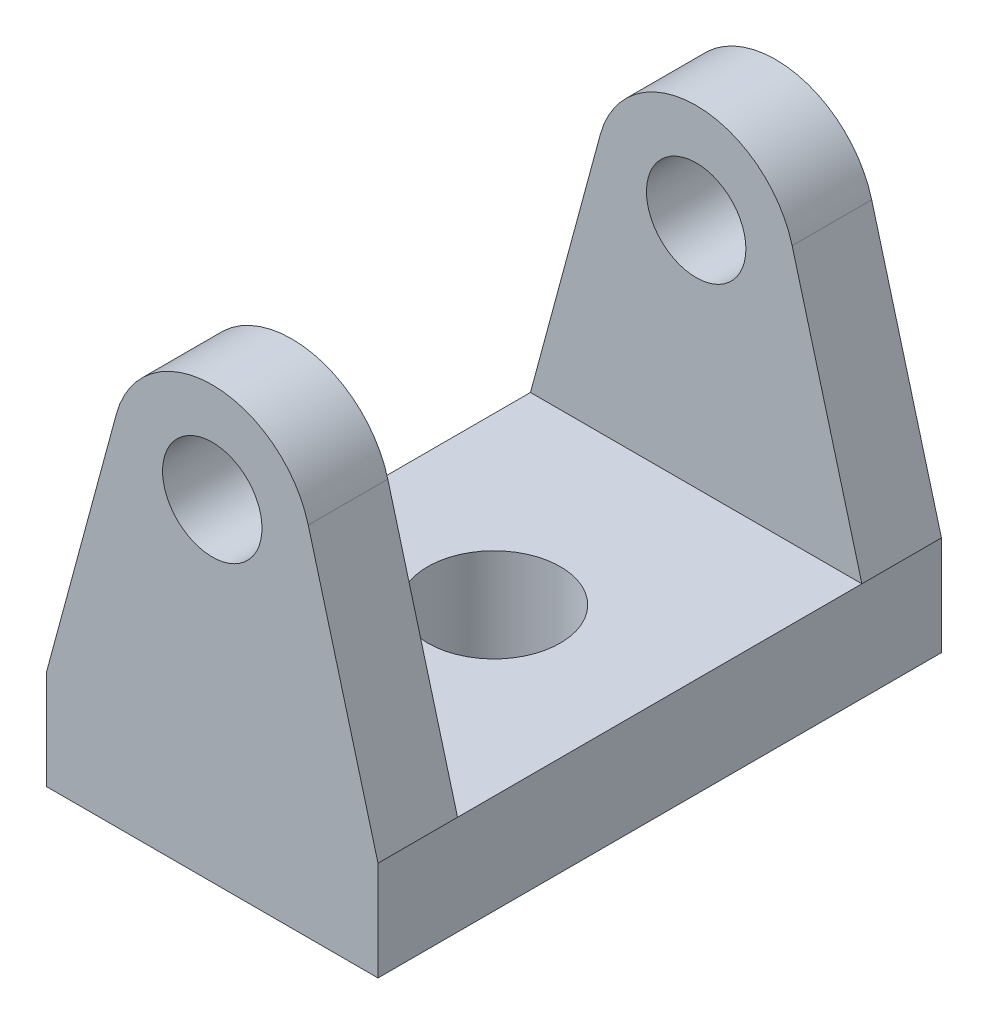
ISO-10303-21;
HEADER;
FILE_DESCRIPTION(('STEP AP214'),'2;1');
FILE_NAME('part.step','',(''),(''),'','','');
FILE_SCHEMA(('AUTOMOTIVE_DESIGN { 1 0 10303 214 1 1 1 1 }'));
ENDSEC;
DATA;
#1=APPLICATION_CONTEXT('core data for automotive mechanical design processes');
#2=APPLICATION_PROTOCOL_DEFINITION('international standard','automotive_design',2000,#1);
#3=PRODUCT_CONTEXT('',#1,'mechanical');
#4=PRODUCT('Part','Part','',(#3));
#5=PRODUCT_RELATED_PRODUCT_CATEGORY('part','',(#4));
#6=PRODUCT_DEFINITION_FORMATION('','',#4);
#7=PRODUCT_DEFINITION_CONTEXT('part definition',#1,'design');
#8=PRODUCT_DEFINITION('design','',#6,#7);
#9=PRODUCT_DEFINITION_SHAPE('','',#8);
#10=(LENGTH_UNIT() NAMED_UNIT(*) SI_UNIT(.MILLI.,.METRE.));
#11=(NAMED_UNIT(*) PLANE_ANGLE_UNIT() SI_UNIT($,.RADIAN.));
#12=(NAMED_UNIT(*) SI_UNIT($,.STERADIAN.) SOLID_ANGLE_UNIT());
#13=UNCERTAINTY_MEASURE_WITH_UNIT(LENGTH_MEASURE(1.E-05),#10,'distance_accuracy_value','');
#14=(GEOMETRIC_REPRESENTATION_CONTEXT(3) GLOBAL_UNCERTAINTY_ASSIGNED_CONTEXT((#13)) GLOBAL_UNIT_ASSIGNED_CONTEXT((#10,
#11,#12)) REPRESENTATION_CONTEXT('',''));
#15=CARTESIAN_POINT('',(0.,0.,0.));
#16=DIRECTION('',(0.,0.,1.));
#17=DIRECTION('',(1.,0.,0.));
#18=AXIS2_PLACEMENT_3D('',#15,#16,#17);
#19=CARTESIAN_POINT('',(50.3737158489723,13.6175602993033,-85.));
#20=DIRECTION('',(0.965348705920133,0.260963361371524,0.));
#21=DIRECTION('',(-0.260963361371524,0.965348705920133,0.));
#22=AXIS2_PLACEMENT_3D('',#19,#20,#21);
#23=PLANE('',#22);
#24=DIRECTION('',(0.,0.,1.));
#25=VECTOR('',#24,1.);
#26=CARTESIAN_POINT('',(39.480230588802,53.9144504205729,-85.));
#27=LINE('',#26,#25);
#28=CARTESIAN_POINT('',(39.480230588802,53.9144504205729,-85.));
#29=VERTEX_POINT('',#28);
#30=CARTESIAN_POINT('',(39.480230588802,53.9144504205729,-73.));
#31=VERTEX_POINT('',#30);
#32=EDGE_CURVE('E94',#29,#31,#27,.T.);
#33=ORIENTED_EDGE('',*,*,#32,.T.);
#34=DIRECTION('',(0.260963361371524,-0.965348705920133,0.));
#35=VECTOR('',#34,1.);
#36=CARTESIAN_POINT('',(50.3737158489723,13.6175602993033,-73.));
#37=LINE('',#36,#35);
#38=CARTESIAN_POINT('',(50.,15.,-73.));
#39=VERTEX_POINT('',#38);
#40=EDGE_CURVE('E199',#31,#39,#37,.T.);
#41=ORIENTED_EDGE('',*,*,#40,.T.);
#42=DIRECTION('',(0.,0.,1.));
#43=VECTOR('',#42,1.);
#44=CARTESIAN_POINT('',(50.,15.,-85.));
#45=LINE('',#44,#43);
#46=CARTESIAN_POINT('',(50.,15.,-85.));
#47=VERTEX_POINT('',#46);
#48=EDGE_CURVE('E11',#47,#39,#45,.T.);
#49=ORIENTED_EDGE('',*,*,#48,.F.);
#50=DIRECTION('',(-0.260963361371524,0.965348705920133,0.));
#51=VECTOR('',#50,1.);
#52=CARTESIAN_POINT('',(50.3737158489723,13.6175602993033,-85.));
#53=LINE('',#52,#51);
#54=EDGE_CURVE('E162',#47,#29,#53,.T.);
#55=ORIENTED_EDGE('',*,*,#54,.T.);
#56=EDGE_LOOP('',(#33,#41,#49,#55));
#57=FACE_BOUND('',#56,.T.);
#58=ADVANCED_FACE('F35',(#57),#23,.T.);
#59=CARTESIAN_POINT('',(50.,15.,-12.));
#60=VERTEX_POINT('',#59);
#61=CARTESIAN_POINT('',(50.,15.,0.));
#62=VERTEX_POINT('',#61);
#63=EDGE_CURVE('E43',#60,#62,#45,.T.);
#64=ORIENTED_EDGE('',*,*,#63,.F.);
#65=DIRECTION('',(-0.260963361371524,0.965348705920133,0.));
#66=VECTOR('',#65,1.);
#67=CARTESIAN_POINT('',(50.3737158489723,13.6175602993033,-12.));
#68=LINE('',#67,#66);
#69=CARTESIAN_POINT('',(39.480230588802,53.9144504205729,-12.));
#70=VERTEX_POINT('',#69);
#71=EDGE_CURVE('E191',#60,#70,#68,.T.);
#72=ORIENTED_EDGE('',*,*,#71,.T.);
#73=CARTESIAN_POINT('',(39.480230588802,53.9144504205729,0.));
#74=VERTEX_POINT('',#73);
#75=EDGE_CURVE('E144',#70,#74,#27,.T.);
#76=ORIENTED_EDGE('',*,*,#75,.T.);
#77=DIRECTION('',(-0.260963361371524,0.965348705920133,0.));
#78=VECTOR('',#77,1.);
#79=CARTESIAN_POINT('',(50.3737158489723,13.6175602993033,0.));
#80=LINE('',#79,#78);
#81=EDGE_CURVE('E145',#62,#74,#80,.T.);
#82=ORIENTED_EDGE('',*,*,#81,.F.);
#83=EDGE_LOOP('',(#64,#72,#76,#82));
#84=FACE_BOUND('',#83,.T.);
#85=ADVANCED_FACE('F225',(#84),#23,.T.);
#86=CARTESIAN_POINT('',(-3.77880964788852,1.02152813967486,-85.));
#87=DIRECTION('',(0.965348705920133,-0.260963361371523,0.));
#88=DIRECTION('',(0.260963361371523,0.965348705920133,0.));
#89=AXIS2_PLACEMENT_3D('',#86,#87,#88);
#90=PLANE('',#89);
#91=DIRECTION('',(-0.260963361371523,-0.965348705920133,0.));
#92=VECTOR('',#91,1.);
#93=CARTESIAN_POINT('',(-3.77880964788852,1.02152813967487,-73.));
#94=LINE('',#93,#92);
#95=CARTESIAN_POINT('',(10.519769411198,53.9144504205729,-73.));
#96=VERTEX_POINT('',#95);
#97=CARTESIAN_POINT('',(0.,15.,-73.));
#98=VERTEX_POINT('',#97);
#99=EDGE_CURVE('E196',#96,#98,#94,.T.);
#100=ORIENTED_EDGE('',*,*,#99,.F.);
#101=DIRECTION('',(0.,0.,1.));
#102=VECTOR('',#101,1.);
#103=CARTESIAN_POINT('',(10.519769411198,53.9144504205729,-85.));
#104=LINE('',#103,#102);
#105=CARTESIAN_POINT('',(10.519769411198,53.9144504205729,-85.));
#106=VERTEX_POINT('',#105);
#107=EDGE_CURVE('E167',#106,#96,#104,.T.);
#108=ORIENTED_EDGE('',*,*,#107,.F.);
#109=DIRECTION('',(0.260963361371523,0.965348705920133,0.));
#110=VECTOR('',#109,1.);
#111=CARTESIAN_POINT('',(-3.77880964788852,1.02152813967486,-85.));
#112=LINE('',#111,#110);
#113=CARTESIAN_POINT('',(0.,15.,-85.));
#114=VERTEX_POINT('',#113);
#115=EDGE_CURVE('E134',#114,#106,#112,.T.);
#116=ORIENTED_EDGE('',*,*,#115,.F.);
#117=DIRECTION('',(0.,0.,1.));
#118=VECTOR('',#117,1.);
#119=CARTESIAN_POINT('',(0.,15.,-85.));
#120=LINE('',#119,#118);
#121=EDGE_CURVE('E128',#114,#98,#120,.T.);
#122=ORIENTED_EDGE('',*,*,#121,.T.);
#123=EDGE_LOOP('',(#100,#108,#116,#122));
#124=FACE_BOUND('',#123,.T.);
#125=ADVANCED_FACE('F222',(#124),#90,.F.);
#126=DIRECTION('',(0.260963361371523,0.965348705920133,0.));
#127=VECTOR('',#126,1.);
#128=CARTESIAN_POINT('',(-3.77880964788852,1.02152813967486,-12.));
#129=LINE('',#128,#127);
#130=CARTESIAN_POINT('',(0.,15.,-12.));
#131=VERTEX_POINT('',#130);
#132=CARTESIAN_POINT('',(10.519769411198,53.9144504205729,-12.));
#133=VERTEX_POINT('',#132);
#134=EDGE_CURVE('E51',#131,#133,#129,.T.);
#135=ORIENTED_EDGE('',*,*,#134,.F.);
#136=CARTESIAN_POINT('',(0.,15.,0.));
#137=VERTEX_POINT('',#136);
#138=EDGE_CURVE('E166',#131,#137,#120,.T.);
#139=ORIENTED_EDGE('',*,*,#138,.T.);
#140=DIRECTION('',(0.260963361371523,0.965348705920133,0.));
#141=VECTOR('',#140,1.);
#142=CARTESIAN_POINT('',(-3.77880964788852,1.02152813967486,0.));
#143=LINE('',#142,#141);
#144=CARTESIAN_POINT('',(10.519769411198,53.9144504205729,0.));
#145=VERTEX_POINT('',#144);
#146=EDGE_CURVE('E152',#137,#145,#143,.T.);
#147=ORIENTED_EDGE('',*,*,#146,.T.);
#148=EDGE_CURVE('E170',#133,#145,#104,.T.);
#149=ORIENTED_EDGE('',*,*,#148,.F.);
#150=EDGE_LOOP('',(#135,#139,#147,#149));
#151=FACE_BOUND('',#150,.T.);
#152=ADVANCED_FACE('F224',(#151),#90,.F.);
#153=CARTESIAN_POINT('',(25.,50.,-85.));
#154=DIRECTION('',(0.,0.,1.));
#155=DIRECTION('',(1.,0.,0.));
#156=AXIS2_PLACEMENT_3D('',#153,#154,#155);
#157=CYLINDRICAL_SURFACE('',#156,15.);
#158=ORIENTED_EDGE('',*,*,#107,.T.);
#159=CARTESIAN_POINT('',(25.,50.,-73.));
#160=DIRECTION('',(0.,0.,1.));
#161=DIRECTION('',(0.,-1.,0.));
#162=AXIS2_PLACEMENT_3D('',#159,#160,#161);
#163=CIRCLE('',#162,15.);
#164=EDGE_CURVE('E194',#96,#31,#163,.F.);
#165=ORIENTED_EDGE('',*,*,#164,.T.);
#166=ORIENTED_EDGE('',*,*,#32,.F.);
#167=CARTESIAN_POINT('',(25.,50.,-85.));
#168=DIRECTION('',(0.,0.,1.));
#169=DIRECTION('',(1.,0.,0.));
#170=AXIS2_PLACEMENT_3D('',#167,#168,#169);
#171=CIRCLE('',#170,15.);
#172=EDGE_CURVE('E136',#29,#106,#171,.T.);
#173=ORIENTED_EDGE('',*,*,#172,.T.);
#174=EDGE_LOOP('',(#158,#165,#166,#173));
#175=FACE_BOUND('',#174,.T.);
#176=ADVANCED_FACE('F202',(#175),#157,.T.);
#177=ORIENTED_EDGE('',*,*,#75,.F.);
#178=CARTESIAN_POINT('',(25.,50.,-12.));
#179=DIRECTION('',(0.,0.,-1.));
#180=DIRECTION('',(0.,1.,0.));
#181=AXIS2_PLACEMENT_3D('',#178,#179,#180);
#182=CIRCLE('',#181,15.);
#183=EDGE_CURVE('E173',#70,#133,#182,.F.);
#184=ORIENTED_EDGE('',*,*,#183,.T.);
#185=ORIENTED_EDGE('',*,*,#148,.T.);
#186=CARTESIAN_POINT('',(25.,50.,0.));
#187=DIRECTION('',(0.,0.,1.));
#188=DIRECTION('',(1.,0.,0.));
#189=AXIS2_PLACEMENT_3D('',#186,#187,#188);
#190=CIRCLE('',#189,15.);
#191=EDGE_CURVE('E148',#74,#145,#190,.T.);
#192=ORIENTED_EDGE('',*,*,#191,.F.);
#193=EDGE_LOOP('',(#177,#184,#185,#192));
#194=FACE_BOUND('',#193,.T.);
#195=ADVANCED_FACE('F261',(#194),#157,.T.);
#196=CARTESIAN_POINT('',(25.,50.,-85.));
#197=DIRECTION('',(0.,0.,1.));
#198=DIRECTION('',(1.,0.,0.));
#199=AXIS2_PLACEMENT_3D('',#196,#197,#198);
#200=CYLINDRICAL_SURFACE('',#199,7.50000000000001);
#201=CARTESIAN_POINT('',(25.,50.,-85.));
#202=DIRECTION('',(0.,0.,1.));
#203=DIRECTION('',(1.,0.,0.));
#204=AXIS2_PLACEMENT_3D('',#201,#202,#203);
#205=CIRCLE('',#204,7.50000000000001);
#206=CARTESIAN_POINT('',(32.5,50.,-85.));
#207=VERTEX_POINT('',#206);
#208=EDGE_CURVE('E141',#207,#207,#205,.T.);
#209=ORIENTED_EDGE('',*,*,#208,.F.);
#210=EDGE_LOOP('',(#209));
#211=FACE_BOUND('',#210,.T.);
#212=CARTESIAN_POINT('',(25.,50.,-73.));
#213=DIRECTION('',(0.,0.,1.));
#214=DIRECTION('',(0.,-1.,0.));
#215=AXIS2_PLACEMENT_3D('',#212,#213,#214);
#216=CIRCLE('',#215,7.50000000000001);
#217=CARTESIAN_POINT('',(25.,42.5,-73.));
#218=VERTEX_POINT('',#217);
#219=EDGE_CURVE('E38',#218,#218,#216,.F.);
#220=ORIENTED_EDGE('',*,*,#219,.F.);
#221=EDGE_LOOP('',(#220));
#222=FACE_BOUND('',#221,.T.);
#223=ADVANCED_FACE('F269',(#211,#222),#200,.F.);
#224=CARTESIAN_POINT('',(25.,50.,0.));
#225=DIRECTION('',(0.,0.,1.));
#226=DIRECTION('',(1.,0.,0.));
#227=AXIS2_PLACEMENT_3D('',#224,#225,#226);
#228=CIRCLE('',#227,7.50000000000001);
#229=CARTESIAN_POINT('',(32.5,50.,0.));
#230=VERTEX_POINT('',#229);
#231=EDGE_CURVE('E160',#230,#230,#228,.T.);
#232=ORIENTED_EDGE('',*,*,#231,.T.);
#233=EDGE_LOOP('',(#232));
#234=FACE_BOUND('',#233,.T.);
#235=CARTESIAN_POINT('',(25.,50.,-12.));
#236=DIRECTION('',(0.,0.,-1.));
#237=DIRECTION('',(0.,1.,0.));
#238=AXIS2_PLACEMENT_3D('',#235,#236,#237);
#239=CIRCLE('',#238,7.50000000000001);
#240=CARTESIAN_POINT('',(25.,57.5,-12.));
#241=VERTEX_POINT('',#240);
#242=EDGE_CURVE('E171',#241,#241,#239,.F.);
#243=ORIENTED_EDGE('',*,*,#242,.F.);
#244=EDGE_LOOP('',(#243));
#245=FACE_BOUND('',#244,.T.);
#246=ADVANCED_FACE('F278',(#234,#245),#200,.F.);
#247=CARTESIAN_POINT('',(50.,0.,-85.));
#248=DIRECTION('',(-1.,0.,0.));
#249=DIRECTION('',(0.,0.,1.));
#250=AXIS2_PLACEMENT_3D('',#247,#248,#249);
#251=PLANE('',#250);
#252=DIRECTION('',(0.,-1.,0.));
#253=VECTOR('',#252,1.);
#254=CARTESIAN_POINT('',(50.,0.,0.));
#255=LINE('',#254,#253);
#256=CARTESIAN_POINT('',(50.,0.,0.));
#257=VERTEX_POINT('',#256);
#258=EDGE_CURVE('E158',#62,#257,#255,.T.);
#259=ORIENTED_EDGE('',*,*,#258,.T.);
#260=DIRECTION('',(0.,0.,1.));
#261=VECTOR('',#260,1.);
#262=CARTESIAN_POINT('',(50.,0.,-85.));
#263=LINE('',#262,#261);
#264=CARTESIAN_POINT('',(50.,0.,-85.));
#265=VERTEX_POINT('',#264);
#266=EDGE_CURVE('E127',#265,#257,#263,.T.);
#267=ORIENTED_EDGE('',*,*,#266,.F.);
#268=DIRECTION('',(0.,-1.,0.));
#269=VECTOR('',#268,1.);
#270=CARTESIAN_POINT('',(50.,0.,-85.));
#271=LINE('',#270,#269);
#272=EDGE_CURVE('E114',#47,#265,#271,.T.);
#273=ORIENTED_EDGE('',*,*,#272,.F.);
#274=ORIENTED_EDGE('',*,*,#48,.T.);
#275=DIRECTION('',(0.,0.,-1.));
#276=VECTOR('',#275,1.);
#277=CARTESIAN_POINT('',(50.,15.,-85.));
#278=LINE('',#277,#276);
#279=EDGE_CURVE('E149',#60,#39,#278,.T.);
#280=ORIENTED_EDGE('',*,*,#279,.F.);
#281=ORIENTED_EDGE('',*,*,#63,.T.);
#282=EDGE_LOOP('',(#259,#267,#273,#274,#280,#281));
#283=FACE_BOUND('',#282,.T.);
#284=ADVANCED_FACE('F288',(#283),#251,.F.);
#285=CARTESIAN_POINT('',(0.,0.,-85.));
#286=DIRECTION('',(0.,1.,0.));
#287=DIRECTION('',(-1.,0.,0.));
#288=AXIS2_PLACEMENT_3D('',#285,#286,#287);
#289=PLANE('',#288);
#290=CARTESIAN_POINT('',(25.,0.,-42.5));
#291=DIRECTION('',(0.,1.,0.));
#292=DIRECTION('',(-1.,0.,0.));
#293=AXIS2_PLACEMENT_3D('',#290,#291,#292);
#294=CIRCLE('',#293,10.);
#295=CARTESIAN_POINT('',(15.,0.,-42.5));
#296=VERTEX_POINT('',#295);
#297=EDGE_CURVE('E374',#296,#296,#294,.T.);
#298=ORIENTED_EDGE('',*,*,#297,.T.);
#299=EDGE_LOOP('',(#298));
#300=FACE_BOUND('',#299,.T.);
#301=DIRECTION('',(-1.,0.,0.));
#302=VECTOR('',#301,1.);
#303=CARTESIAN_POINT('',(0.,0.,0.));
#304=LINE('',#303,#302);
#305=CARTESIAN_POINT('',(0.,0.,0.));
#306=VERTEX_POINT('',#305);
#307=EDGE_CURVE('E123',#257,#306,#304,.T.);
#308=ORIENTED_EDGE('',*,*,#307,.T.);
#309=DIRECTION('',(0.,0.,1.));
#310=VECTOR('',#309,1.);
#311=CARTESIAN_POINT('',(0.,0.,-85.));
#312=LINE('',#311,#310);
#313=CARTESIAN_POINT('',(0.,0.,-85.));
#314=VERTEX_POINT('',#313);
#315=EDGE_CURVE('E120',#314,#306,#312,.T.);
#316=ORIENTED_EDGE('',*,*,#315,.F.);
#317=DIRECTION('',(-1.,0.,0.));
#318=VECTOR('',#317,1.);
#319=CARTESIAN_POINT('',(0.,0.,-85.));
#320=LINE('',#319,#318);
#321=EDGE_CURVE('E106',#265,#314,#320,.T.);
#322=ORIENTED_EDGE('',*,*,#321,.F.);
#323=ORIENTED_EDGE('',*,*,#266,.T.);
#324=EDGE_LOOP('',(#308,#316,#322,#323));
#325=FACE_BOUND('',#324,.T.);
#326=ADVANCED_FACE('F121',(#300,#325),#289,.F.);
#327=CARTESIAN_POINT('',(0.,0.,-85.));
#328=DIRECTION('',(1.,0.,0.));
#329=DIRECTION('',(0.,0.,-1.));
#330=AXIS2_PLACEMENT_3D('',#327,#328,#329);
#331=PLANE('',#330);
#332=DIRECTION('',(0.,1.,0.));
#333=VECTOR('',#332,1.);
#334=CARTESIAN_POINT('',(0.,0.,0.));
#335=LINE('',#334,#333);
#336=EDGE_CURVE('E155',#306,#137,#335,.T.);
#337=ORIENTED_EDGE('',*,*,#336,.T.);
#338=ORIENTED_EDGE('',*,*,#138,.F.);
#339=DIRECTION('',(0.,0.,-1.));
#340=VECTOR('',#339,1.);
#341=CARTESIAN_POINT('',(0.,15.,-12.));
#342=LINE('',#341,#340);
#343=EDGE_CURVE('E186',#131,#98,#342,.T.);
#344=ORIENTED_EDGE('',*,*,#343,.T.);
#345=ORIENTED_EDGE('',*,*,#121,.F.);
#346=DIRECTION('',(0.,1.,0.));
#347=VECTOR('',#346,1.);
#348=CARTESIAN_POINT('',(0.,0.,-85.));
#349=LINE('',#348,#347);
#350=EDGE_CURVE('E112',#314,#114,#349,.T.);
#351=ORIENTED_EDGE('',*,*,#350,.F.);
#352=ORIENTED_EDGE('',*,*,#315,.T.);
#353=EDGE_LOOP('',(#337,#338,#344,#345,#351,#352));
#354=FACE_BOUND('',#353,.T.);
#355=ADVANCED_FACE('F130',(#354),#331,.F.);
#356=CARTESIAN_POINT('',(0.,0.,-85.));
#357=DIRECTION('',(0.,0.,1.));
#358=DIRECTION('',(1.,0.,0.));
#359=AXIS2_PLACEMENT_3D('',#356,#357,#358);
#360=PLANE('',#359);
#361=ORIENTED_EDGE('',*,*,#54,.F.);
#362=ORIENTED_EDGE('',*,*,#272,.T.);
#363=ORIENTED_EDGE('',*,*,#321,.T.);
#364=ORIENTED_EDGE('',*,*,#350,.T.);
#365=ORIENTED_EDGE('',*,*,#115,.T.);
#366=ORIENTED_EDGE('',*,*,#172,.F.);
#367=EDGE_LOOP('',(#361,#362,#363,#364,#365,#366));
#368=FACE_BOUND('',#367,.T.);
#369=ORIENTED_EDGE('',*,*,#208,.T.);
#370=EDGE_LOOP('',(#369));
#371=FACE_BOUND('',#370,.T.);
#372=ADVANCED_FACE('F109',(#368,#371),#360,.F.);
#373=CARTESIAN_POINT('',(0.,0.,0.));
#374=DIRECTION('',(0.,0.,1.));
#375=DIRECTION('',(1.,0.,0.));
#376=AXIS2_PLACEMENT_3D('',#373,#374,#375);
#377=PLANE('',#376);
#378=ORIENTED_EDGE('',*,*,#81,.T.);
#379=ORIENTED_EDGE('',*,*,#191,.T.);
#380=ORIENTED_EDGE('',*,*,#146,.F.);
#381=ORIENTED_EDGE('',*,*,#336,.F.);
#382=ORIENTED_EDGE('',*,*,#307,.F.);
#383=ORIENTED_EDGE('',*,*,#258,.F.);
#384=EDGE_LOOP('',(#378,#379,#380,#381,#382,#383));
#385=FACE_BOUND('',#384,.T.);
#386=ORIENTED_EDGE('',*,*,#231,.F.);
#387=EDGE_LOOP('',(#386));
#388=FACE_BOUND('',#387,.T.);
#389=ADVANCED_FACE('F345',(#385,#388),#377,.T.);
#390=CARTESIAN_POINT('',(71.,15.,-12.));
#391=DIRECTION('',(0.,1.,0.));
#392=DIRECTION('',(0.,0.,1.));
#393=AXIS2_PLACEMENT_3D('',#390,#391,#392);
#394=PLANE('',#393);
#395=CARTESIAN_POINT('',(25.,15.,-42.5));
#396=DIRECTION('',(0.,1.,0.));
#397=DIRECTION('',(0.,0.,1.));
#398=AXIS2_PLACEMENT_3D('',#395,#396,#397);
#399=CIRCLE('',#398,10.);
#400=CARTESIAN_POINT('',(25.,15.,-32.5));
#401=VERTEX_POINT('',#400);
#402=EDGE_CURVE('E376',#401,#401,#399,.T.);
#403=ORIENTED_EDGE('',*,*,#402,.F.);
#404=EDGE_LOOP('',(#403));
#405=FACE_BOUND('',#404,.T.);
#406=ORIENTED_EDGE('',*,*,#279,.T.);
#407=DIRECTION('',(-1.,0.,0.));
#408=VECTOR('',#407,1.);
#409=CARTESIAN_POINT('',(71.,15.,-73.));
#410=LINE('',#409,#408);
#411=EDGE_CURVE('E174',#39,#98,#410,.T.);
#412=ORIENTED_EDGE('',*,*,#411,.T.);
#413=ORIENTED_EDGE('',*,*,#343,.F.);
#414=DIRECTION('',(-1.,0.,0.));
#415=VECTOR('',#414,1.);
#416=CARTESIAN_POINT('',(71.,15.,-12.));
#417=LINE('',#416,#415);
#418=EDGE_CURVE('E179',#60,#131,#417,.T.);
#419=ORIENTED_EDGE('',*,*,#418,.F.);
#420=EDGE_LOOP('',(#406,#412,#413,#419));
#421=FACE_BOUND('',#420,.T.);
#422=ADVANCED_FACE('F318',(#405,#421),#394,.T.);
#423=CARTESIAN_POINT('',(71.,15.,-73.));
#424=DIRECTION('',(0.,0.,1.));
#425=DIRECTION('',(0.,-1.,0.));
#426=AXIS2_PLACEMENT_3D('',#423,#424,#425);
#427=PLANE('',#426);
#428=ORIENTED_EDGE('',*,*,#164,.F.);
#429=ORIENTED_EDGE('',*,*,#99,.T.);
#430=ORIENTED_EDGE('',*,*,#411,.F.);
#431=ORIENTED_EDGE('',*,*,#40,.F.);
#432=EDGE_LOOP('',(#428,#429,#430,#431));
#433=FACE_BOUND('',#432,.T.);
#434=ORIENTED_EDGE('',*,*,#219,.T.);
#435=EDGE_LOOP('',(#434));
#436=FACE_BOUND('',#435,.T.);
#437=ADVANCED_FACE('F219',(#433,#436),#427,.T.);
#438=CARTESIAN_POINT('',(71.,65.9652969019221,-12.));
#439=DIRECTION('',(0.,0.,-1.));
#440=DIRECTION('',(0.,1.,0.));
#441=AXIS2_PLACEMENT_3D('',#438,#439,#440);
#442=PLANE('',#441);
#443=ORIENTED_EDGE('',*,*,#418,.T.);
#444=ORIENTED_EDGE('',*,*,#134,.T.);
#445=ORIENTED_EDGE('',*,*,#183,.F.);
#446=ORIENTED_EDGE('',*,*,#71,.F.);
#447=EDGE_LOOP('',(#443,#444,#445,#446));
#448=FACE_BOUND('',#447,.T.);
#449=ORIENTED_EDGE('',*,*,#242,.T.);
#450=EDGE_LOOP('',(#449));
#451=FACE_BOUND('',#450,.T.);
#452=ADVANCED_FACE('F317',(#448,#451),#442,.T.);
#453=CARTESIAN_POINT('',(25.,-7.99999999999999,-42.5));
#454=DIRECTION('',(0.,1.,0.));
#455=DIRECTION('',(0.,0.,1.));
#456=AXIS2_PLACEMENT_3D('',#453,#454,#455);
#457=CYLINDRICAL_SURFACE('',#456,10.);
#458=ORIENTED_EDGE('',*,*,#402,.T.);
#459=EDGE_LOOP('',(#458));
#460=FACE_BOUND('',#459,.T.);
#461=ORIENTED_EDGE('',*,*,#297,.F.);
#462=EDGE_LOOP('',(#461));
#463=FACE_BOUND('',#462,.T.);
#464=ADVANCED_FACE('F329',(#460,#463),#457,.F.);
#465=CLOSED_SHELL('',(#58,#85,#125,#152,#176,#195,#223,#246,#284,#326,#355,#372,#389,#422,#437,
#452,#464));
#466=MANIFOLD_SOLID_BREP('B2',#465);
#467=ADVANCED_BREP_SHAPE_REPRESENTATION('',(#18,#466),#14);
#468=SHAPE_DEFINITION_REPRESENTATION(#9,#467);
ENDSEC;
END-ISO-10303-21;
